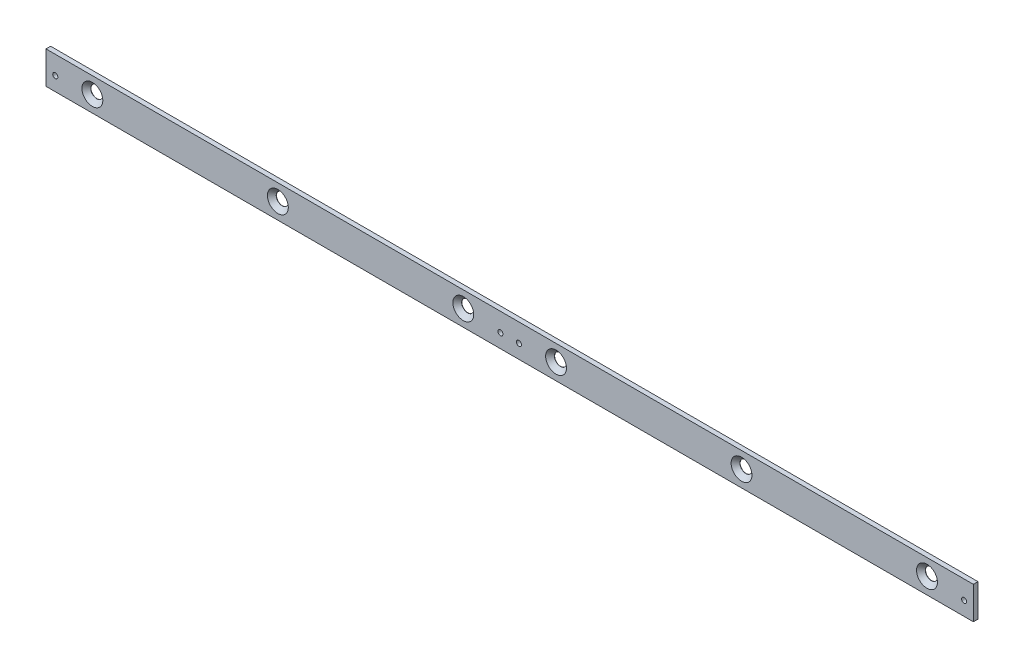
ISO-10303-21;
HEADER;
FILE_DESCRIPTION(('STEP AP214'),'2;1');
FILE_NAME('part.step','',(''),(''),'','','');
FILE_SCHEMA(('AUTOMOTIVE_DESIGN { 1 0 10303 214 1 1 1 1 }'));
ENDSEC;
DATA;
#1=APPLICATION_CONTEXT('core data for automotive mechanical design processes');
#2=APPLICATION_PROTOCOL_DEFINITION('international standard','automotive_design',2000,#1);
#3=PRODUCT_CONTEXT('',#1,'mechanical');
#4=PRODUCT('Part','Part','',(#3));
#5=PRODUCT_RELATED_PRODUCT_CATEGORY('part','',(#4));
#6=PRODUCT_DEFINITION_FORMATION('','',#4);
#7=PRODUCT_DEFINITION_CONTEXT('part definition',#1,'design');
#8=PRODUCT_DEFINITION('design','',#6,#7);
#9=PRODUCT_DEFINITION_SHAPE('','',#8);
#10=(LENGTH_UNIT() NAMED_UNIT(*) SI_UNIT(.MILLI.,.METRE.));
#11=(NAMED_UNIT(*) PLANE_ANGLE_UNIT() SI_UNIT($,.RADIAN.));
#12=(NAMED_UNIT(*) SI_UNIT($,.STERADIAN.) SOLID_ANGLE_UNIT());
#13=UNCERTAINTY_MEASURE_WITH_UNIT(LENGTH_MEASURE(1.E-05),#10,'distance_accuracy_value','');
#14=(GEOMETRIC_REPRESENTATION_CONTEXT(3) GLOBAL_UNCERTAINTY_ASSIGNED_CONTEXT((#13)) GLOBAL_UNIT_ASSIGNED_CONTEXT((#10,
#11,#12)) REPRESENTATION_CONTEXT('',''));
#15=CARTESIAN_POINT('',(0.,0.,0.));
#16=DIRECTION('',(0.,0.,1.));
#17=DIRECTION('',(1.,0.,0.));
#18=AXIS2_PLACEMENT_3D('',#15,#16,#17);
#19=CARTESIAN_POINT('',(-200.,6.99999999999999,2.));
#20=DIRECTION('',(0.,0.,-1.));
#21=DIRECTION('',(-1.,0.,0.));
#22=AXIS2_PLACEMENT_3D('',#19,#20,#21);
#23=PLANE('',#22);
#24=CARTESIAN_POINT('',(180.,0.,2.));
#25=DIRECTION('',(0.,0.,-1.));
#26=DIRECTION('',(-1.,0.,0.));
#27=AXIS2_PLACEMENT_3D('',#24,#25,#26);
#28=CIRCLE('',#27,4.5);
#29=CARTESIAN_POINT('',(175.5,0.,2.));
#30=VERTEX_POINT('',#29);
#31=EDGE_CURVE('E130',#30,#30,#28,.T.);
#32=ORIENTED_EDGE('',*,*,#31,.T.);
#33=EDGE_LOOP('',(#32));
#34=FACE_BOUND('',#33,.T.);
#35=CARTESIAN_POINT('',(100.,0.,2.));
#36=DIRECTION('',(0.,0.,-1.));
#37=DIRECTION('',(-1.,0.,0.));
#38=AXIS2_PLACEMENT_3D('',#35,#36,#37);
#39=CIRCLE('',#38,4.5);
#40=CARTESIAN_POINT('',(95.5,0.,2.));
#41=VERTEX_POINT('',#40);
#42=EDGE_CURVE('E127',#41,#41,#39,.T.);
#43=ORIENTED_EDGE('',*,*,#42,.T.);
#44=EDGE_LOOP('',(#43));
#45=FACE_BOUND('',#44,.T.);
#46=CARTESIAN_POINT('',(20.,0.,2.));
#47=DIRECTION('',(0.,0.,-1.));
#48=DIRECTION('',(-1.,0.,0.));
#49=AXIS2_PLACEMENT_3D('',#46,#47,#48);
#50=CIRCLE('',#49,4.5);
#51=CARTESIAN_POINT('',(15.5,0.,2.));
#52=VERTEX_POINT('',#51);
#53=EDGE_CURVE('E124',#52,#52,#50,.T.);
#54=ORIENTED_EDGE('',*,*,#53,.T.);
#55=EDGE_LOOP('',(#54));
#56=FACE_BOUND('',#55,.T.);
#57=CARTESIAN_POINT('',(-20.,0.,2.));
#58=DIRECTION('',(0.,0.,-1.));
#59=DIRECTION('',(-1.,0.,0.));
#60=AXIS2_PLACEMENT_3D('',#57,#58,#59);
#61=CIRCLE('',#60,4.5);
#62=CARTESIAN_POINT('',(-24.5,0.,2.));
#63=VERTEX_POINT('',#62);
#64=EDGE_CURVE('E121',#63,#63,#61,.T.);
#65=ORIENTED_EDGE('',*,*,#64,.T.);
#66=EDGE_LOOP('',(#65));
#67=FACE_BOUND('',#66,.T.);
#68=CARTESIAN_POINT('',(-100.,0.,2.));
#69=DIRECTION('',(0.,0.,-1.));
#70=DIRECTION('',(-1.,0.,0.));
#71=AXIS2_PLACEMENT_3D('',#68,#69,#70);
#72=CIRCLE('',#71,4.5);
#73=CARTESIAN_POINT('',(-104.5,0.,2.));
#74=VERTEX_POINT('',#73);
#75=EDGE_CURVE('E118',#74,#74,#72,.T.);
#76=ORIENTED_EDGE('',*,*,#75,.T.);
#77=EDGE_LOOP('',(#76));
#78=FACE_BOUND('',#77,.T.);
#79=CARTESIAN_POINT('',(-180.,0.,2.));
#80=DIRECTION('',(0.,0.,-1.));
#81=DIRECTION('',(-1.,0.,0.));
#82=AXIS2_PLACEMENT_3D('',#79,#80,#81);
#83=CIRCLE('',#82,4.5);
#84=CARTESIAN_POINT('',(-184.5,0.,2.));
#85=VERTEX_POINT('',#84);
#86=EDGE_CURVE('E115',#85,#85,#83,.T.);
#87=ORIENTED_EDGE('',*,*,#86,.T.);
#88=EDGE_LOOP('',(#87));
#89=FACE_BOUND('',#88,.T.);
#90=CARTESIAN_POINT('',(4.00000000000001,-1.,2.));
#91=DIRECTION('',(0.,0.,1.));
#92=DIRECTION('',(-1.,0.,0.));
#93=AXIS2_PLACEMENT_3D('',#90,#91,#92);
#94=CIRCLE('',#93,1.1);
#95=CARTESIAN_POINT('',(2.90000000000001,-1.,2.));
#96=VERTEX_POINT('',#95);
#97=EDGE_CURVE('E398',#96,#96,#94,.T.);
#98=ORIENTED_EDGE('',*,*,#97,.F.);
#99=EDGE_LOOP('',(#98));
#100=FACE_BOUND('',#99,.T.);
#101=CARTESIAN_POINT('',(-196.,-1.,2.));
#102=DIRECTION('',(0.,0.,1.));
#103=DIRECTION('',(1.,0.,0.));
#104=AXIS2_PLACEMENT_3D('',#101,#102,#103);
#105=CIRCLE('',#104,1.09999999999999);
#106=CARTESIAN_POINT('',(-194.9,-1.,2.));
#107=VERTEX_POINT('',#106);
#108=EDGE_CURVE('E408',#107,#107,#105,.T.);
#109=ORIENTED_EDGE('',*,*,#108,.F.);
#110=EDGE_LOOP('',(#109));
#111=FACE_BOUND('',#110,.T.);
#112=DIRECTION('',(0.,-1.,0.));
#113=VECTOR('',#112,1.);
#114=CARTESIAN_POINT('',(-200.,-7.00000000000001,2.));
#115=LINE('',#114,#113);
#116=CARTESIAN_POINT('',(-200.,6.99999999999999,2.));
#117=VERTEX_POINT('',#116);
#118=CARTESIAN_POINT('',(-200.,-7.00000000000001,2.));
#119=VERTEX_POINT('',#118);
#120=EDGE_CURVE('E103',#117,#119,#115,.T.);
#121=ORIENTED_EDGE('',*,*,#120,.T.);
#122=DIRECTION('',(1.,0.,0.));
#123=VECTOR('',#122,1.);
#124=CARTESIAN_POINT('',(-200.,-7.00000000000001,2.));
#125=LINE('',#124,#123);
#126=CARTESIAN_POINT('',(200.,-6.99999999999996,2.));
#127=VERTEX_POINT('',#126);
#128=EDGE_CURVE('E85',#119,#127,#125,.T.);
#129=ORIENTED_EDGE('',*,*,#128,.T.);
#130=DIRECTION('',(0.,1.,0.));
#131=VECTOR('',#130,1.);
#132=CARTESIAN_POINT('',(200.,-6.99999999999996,2.));
#133=LINE('',#132,#131);
#134=CARTESIAN_POINT('',(200.,7.00000000000004,2.));
#135=VERTEX_POINT('',#134);
#136=EDGE_CURVE('E49',#127,#135,#133,.T.);
#137=ORIENTED_EDGE('',*,*,#136,.T.);
#138=DIRECTION('',(-1.,0.,0.));
#139=VECTOR('',#138,1.);
#140=CARTESIAN_POINT('',(-200.,6.99999999999999,2.));
#141=LINE('',#140,#139);
#142=EDGE_CURVE('E44',#135,#117,#141,.T.);
#143=ORIENTED_EDGE('',*,*,#142,.T.);
#144=EDGE_LOOP('',(#121,#129,#137,#143));
#145=FACE_BOUND('',#144,.T.);
#146=CARTESIAN_POINT('',(-3.99999999999999,-1.,2.));
#147=DIRECTION('',(0.,0.,1.));
#148=DIRECTION('',(1.,0.,0.));
#149=AXIS2_PLACEMENT_3D('',#146,#147,#148);
#150=CIRCLE('',#149,1.1);
#151=CARTESIAN_POINT('',(-2.89999999999999,-1.,2.));
#152=VERTEX_POINT('',#151);
#153=EDGE_CURVE('E402',#152,#152,#150,.T.);
#154=ORIENTED_EDGE('',*,*,#153,.F.);
#155=EDGE_LOOP('',(#154));
#156=FACE_BOUND('',#155,.T.);
#157=CARTESIAN_POINT('',(196.,-0.999999999999953,2.));
#158=DIRECTION('',(0.,0.,1.));
#159=DIRECTION('',(-1.,0.,0.));
#160=AXIS2_PLACEMENT_3D('',#157,#158,#159);
#161=CIRCLE('',#160,1.09999999999999);
#162=CARTESIAN_POINT('',(194.9,-0.999999999999953,2.));
#163=VERTEX_POINT('',#162);
#164=EDGE_CURVE('E390',#163,#163,#161,.T.);
#165=ORIENTED_EDGE('',*,*,#164,.F.);
#166=EDGE_LOOP('',(#165));
#167=FACE_BOUND('',#166,.T.);
#168=ADVANCED_FACE('F29',(#34,#45,#56,#67,#78,#89,#100,#111,#145,#156,#167),#23,.F.);
#169=CARTESIAN_POINT('',(-200.,6.99999999999999,0.));
#170=DIRECTION('',(0.,0.,-1.));
#171=DIRECTION('',(-1.,0.,0.));
#172=AXIS2_PLACEMENT_3D('',#169,#170,#171);
#173=PLANE('',#172);
#174=CARTESIAN_POINT('',(4.00000000000001,-1.,0.));
#175=DIRECTION('',(0.,0.,1.));
#176=DIRECTION('',(-1.,0.,0.));
#177=AXIS2_PLACEMENT_3D('',#174,#175,#176);
#178=CIRCLE('',#177,1.1);
#179=CARTESIAN_POINT('',(2.90000000000001,-1.,0.));
#180=VERTEX_POINT('',#179);
#181=EDGE_CURVE('E393',#180,#180,#178,.T.);
#182=ORIENTED_EDGE('',*,*,#181,.T.);
#183=EDGE_LOOP('',(#182));
#184=FACE_BOUND('',#183,.T.);
#185=CARTESIAN_POINT('',(-196.,-1.,0.));
#186=DIRECTION('',(0.,0.,1.));
#187=DIRECTION('',(1.,0.,0.));
#188=AXIS2_PLACEMENT_3D('',#185,#186,#187);
#189=CIRCLE('',#188,1.09999999999999);
#190=CARTESIAN_POINT('',(-194.9,-1.,0.));
#191=VERTEX_POINT('',#190);
#192=EDGE_CURVE('E405',#191,#191,#189,.T.);
#193=ORIENTED_EDGE('',*,*,#192,.T.);
#194=EDGE_LOOP('',(#193));
#195=FACE_BOUND('',#194,.T.);
#196=CARTESIAN_POINT('',(100.,0.,0.));
#197=DIRECTION('',(0.,0.,1.));
#198=DIRECTION('',(-1.,0.,0.));
#199=AXIS2_PLACEMENT_3D('',#196,#197,#198);
#200=CIRCLE('',#199,2.6);
#201=CARTESIAN_POINT('',(97.4,0.,0.));
#202=VERTEX_POINT('',#201);
#203=EDGE_CURVE('E368',#202,#202,#200,.T.);
#204=ORIENTED_EDGE('',*,*,#203,.T.);
#205=EDGE_LOOP('',(#204));
#206=FACE_BOUND('',#205,.T.);
#207=CARTESIAN_POINT('',(-20.,0.,0.));
#208=DIRECTION('',(0.,0.,1.));
#209=DIRECTION('',(1.,0.,0.));
#210=AXIS2_PLACEMENT_3D('',#207,#208,#209);
#211=CIRCLE('',#210,2.6);
#212=CARTESIAN_POINT('',(-17.4,0.,0.));
#213=VERTEX_POINT('',#212);
#214=EDGE_CURVE('E367',#213,#213,#211,.T.);
#215=ORIENTED_EDGE('',*,*,#214,.T.);
#216=EDGE_LOOP('',(#215));
#217=FACE_BOUND('',#216,.T.);
#218=CARTESIAN_POINT('',(-180.,0.,0.));
#219=DIRECTION('',(0.,0.,1.));
#220=DIRECTION('',(1.,0.,0.));
#221=AXIS2_PLACEMENT_3D('',#218,#219,#220);
#222=CIRCLE('',#221,2.59999999999999);
#223=CARTESIAN_POINT('',(-177.4,0.,0.));
#224=VERTEX_POINT('',#223);
#225=EDGE_CURVE('E93',#224,#224,#222,.T.);
#226=ORIENTED_EDGE('',*,*,#225,.T.);
#227=EDGE_LOOP('',(#226));
#228=FACE_BOUND('',#227,.T.);
#229=DIRECTION('',(0.,-1.,0.));
#230=VECTOR('',#229,1.);
#231=CARTESIAN_POINT('',(-200.,-7.00000000000001,0.));
#232=LINE('',#231,#230);
#233=CARTESIAN_POINT('',(-200.,6.99999999999999,0.));
#234=VERTEX_POINT('',#233);
#235=CARTESIAN_POINT('',(-200.,-7.00000000000001,0.));
#236=VERTEX_POINT('',#235);
#237=EDGE_CURVE('E76',#234,#236,#232,.T.);
#238=ORIENTED_EDGE('',*,*,#237,.F.);
#239=DIRECTION('',(-1.,0.,0.));
#240=VECTOR('',#239,1.);
#241=CARTESIAN_POINT('',(-200.,6.99999999999999,0.));
#242=LINE('',#241,#240);
#243=CARTESIAN_POINT('',(200.,7.00000000000004,0.));
#244=VERTEX_POINT('',#243);
#245=EDGE_CURVE('E101',#244,#234,#242,.T.);
#246=ORIENTED_EDGE('',*,*,#245,.F.);
#247=DIRECTION('',(0.,1.,0.));
#248=VECTOR('',#247,1.);
#249=CARTESIAN_POINT('',(200.,-6.99999999999996,0.));
#250=LINE('',#249,#248);
#251=CARTESIAN_POINT('',(200.,-6.99999999999996,0.));
#252=VERTEX_POINT('',#251);
#253=EDGE_CURVE('E77',#252,#244,#250,.T.);
#254=ORIENTED_EDGE('',*,*,#253,.F.);
#255=DIRECTION('',(1.,0.,0.));
#256=VECTOR('',#255,1.);
#257=CARTESIAN_POINT('',(-200.,-7.00000000000001,0.));
#258=LINE('',#257,#256);
#259=EDGE_CURVE('E70',#236,#252,#258,.T.);
#260=ORIENTED_EDGE('',*,*,#259,.F.);
#261=EDGE_LOOP('',(#238,#246,#254,#260));
#262=FACE_BOUND('',#261,.T.);
#263=CARTESIAN_POINT('',(-100.,0.,0.));
#264=DIRECTION('',(0.,0.,1.));
#265=DIRECTION('',(1.,0.,0.));
#266=AXIS2_PLACEMENT_3D('',#263,#264,#265);
#267=CIRCLE('',#266,2.6);
#268=CARTESIAN_POINT('',(-97.4,0.,0.));
#269=VERTEX_POINT('',#268);
#270=EDGE_CURVE('E96',#269,#269,#267,.T.);
#271=ORIENTED_EDGE('',*,*,#270,.T.);
#272=EDGE_LOOP('',(#271));
#273=FACE_BOUND('',#272,.T.);
#274=CARTESIAN_POINT('',(20.,0.,0.));
#275=DIRECTION('',(0.,0.,1.));
#276=DIRECTION('',(-1.,0.,0.));
#277=AXIS2_PLACEMENT_3D('',#274,#275,#276);
#278=CIRCLE('',#277,2.6);
#279=CARTESIAN_POINT('',(17.4,0.,0.));
#280=VERTEX_POINT('',#279);
#281=EDGE_CURVE('E365',#280,#280,#278,.T.);
#282=ORIENTED_EDGE('',*,*,#281,.T.);
#283=EDGE_LOOP('',(#282));
#284=FACE_BOUND('',#283,.T.);
#285=CARTESIAN_POINT('',(180.,0.,0.));
#286=DIRECTION('',(0.,0.,1.));
#287=DIRECTION('',(-1.,0.,0.));
#288=AXIS2_PLACEMENT_3D('',#285,#286,#287);
#289=CIRCLE('',#288,2.59999999999999);
#290=CARTESIAN_POINT('',(177.4,0.,0.));
#291=VERTEX_POINT('',#290);
#292=EDGE_CURVE('E373',#291,#291,#289,.T.);
#293=ORIENTED_EDGE('',*,*,#292,.T.);
#294=EDGE_LOOP('',(#293));
#295=FACE_BOUND('',#294,.T.);
#296=CARTESIAN_POINT('',(-3.99999999999999,-1.,0.));
#297=DIRECTION('',(0.,0.,1.));
#298=DIRECTION('',(1.,0.,0.));
#299=AXIS2_PLACEMENT_3D('',#296,#297,#298);
#300=CIRCLE('',#299,1.1);
#301=CARTESIAN_POINT('',(-2.89999999999999,-1.,0.));
#302=VERTEX_POINT('',#301);
#303=EDGE_CURVE('E385',#302,#302,#300,.T.);
#304=ORIENTED_EDGE('',*,*,#303,.T.);
#305=EDGE_LOOP('',(#304));
#306=FACE_BOUND('',#305,.T.);
#307=CARTESIAN_POINT('',(196.,-0.999999999999953,0.));
#308=DIRECTION('',(0.,0.,1.));
#309=DIRECTION('',(-1.,0.,0.));
#310=AXIS2_PLACEMENT_3D('',#307,#308,#309);
#311=CIRCLE('',#310,1.09999999999999);
#312=CARTESIAN_POINT('',(194.9,-0.999999999999953,0.));
#313=VERTEX_POINT('',#312);
#314=EDGE_CURVE('E388',#313,#313,#311,.T.);
#315=ORIENTED_EDGE('',*,*,#314,.T.);
#316=EDGE_LOOP('',(#315));
#317=FACE_BOUND('',#316,.T.);
#318=ADVANCED_FACE('F72',(#184,#195,#206,#217,#228,#262,#273,#284,#295,#306,#317),#173,.T.);
#319=CARTESIAN_POINT('',(-200.,-7.00000000000001,2.));
#320=DIRECTION('',(1.,0.,0.));
#321=DIRECTION('',(0.,0.,-1.));
#322=AXIS2_PLACEMENT_3D('',#319,#320,#321);
#323=PLANE('',#322);
#324=ORIENTED_EDGE('',*,*,#237,.T.);
#325=DIRECTION('',(0.,0.,-1.));
#326=VECTOR('',#325,1.);
#327=CARTESIAN_POINT('',(-200.,-7.00000000000001,2.));
#328=LINE('',#327,#326);
#329=EDGE_CURVE('E83',#119,#236,#328,.T.);
#330=ORIENTED_EDGE('',*,*,#329,.F.);
#331=ORIENTED_EDGE('',*,*,#120,.F.);
#332=DIRECTION('',(0.,0.,-1.));
#333=VECTOR('',#332,1.);
#334=CARTESIAN_POINT('',(-200.,6.99999999999999,2.));
#335=LINE('',#334,#333);
#336=EDGE_CURVE('E92',#117,#234,#335,.T.);
#337=ORIENTED_EDGE('',*,*,#336,.T.);
#338=EDGE_LOOP('',(#324,#330,#331,#337));
#339=FACE_BOUND('',#338,.T.);
#340=ADVANCED_FACE('F31',(#339),#323,.F.);
#341=CARTESIAN_POINT('',(-200.,-7.00000000000001,2.));
#342=DIRECTION('',(0.,1.,0.));
#343=DIRECTION('',(-1.,0.,0.));
#344=AXIS2_PLACEMENT_3D('',#341,#342,#343);
#345=PLANE('',#344);
#346=ORIENTED_EDGE('',*,*,#259,.T.);
#347=DIRECTION('',(0.,0.,-1.));
#348=VECTOR('',#347,1.);
#349=CARTESIAN_POINT('',(200.,-6.99999999999996,2.));
#350=LINE('',#349,#348);
#351=EDGE_CURVE('E89',#127,#252,#350,.T.);
#352=ORIENTED_EDGE('',*,*,#351,.F.);
#353=ORIENTED_EDGE('',*,*,#128,.F.);
#354=ORIENTED_EDGE('',*,*,#329,.T.);
#355=EDGE_LOOP('',(#346,#352,#353,#354));
#356=FACE_BOUND('',#355,.T.);
#357=ADVANCED_FACE('F84',(#356),#345,.F.);
#358=CARTESIAN_POINT('',(200.,-6.99999999999996,2.));
#359=DIRECTION('',(-1.,0.,0.));
#360=DIRECTION('',(0.,0.,1.));
#361=AXIS2_PLACEMENT_3D('',#358,#359,#360);
#362=PLANE('',#361);
#363=ORIENTED_EDGE('',*,*,#253,.T.);
#364=DIRECTION('',(0.,0.,-1.));
#365=VECTOR('',#364,1.);
#366=CARTESIAN_POINT('',(200.,7.00000000000004,2.));
#367=LINE('',#366,#365);
#368=EDGE_CURVE('E109',#135,#244,#367,.T.);
#369=ORIENTED_EDGE('',*,*,#368,.F.);
#370=ORIENTED_EDGE('',*,*,#136,.F.);
#371=ORIENTED_EDGE('',*,*,#351,.T.);
#372=EDGE_LOOP('',(#363,#369,#370,#371));
#373=FACE_BOUND('',#372,.T.);
#374=ADVANCED_FACE('F178',(#373),#362,.F.);
#375=CARTESIAN_POINT('',(-200.,6.99999999999999,2.));
#376=DIRECTION('',(0.,-1.,0.));
#377=DIRECTION('',(1.,0.,0.));
#378=AXIS2_PLACEMENT_3D('',#375,#376,#377);
#379=PLANE('',#378);
#380=ORIENTED_EDGE('',*,*,#245,.T.);
#381=ORIENTED_EDGE('',*,*,#336,.F.);
#382=ORIENTED_EDGE('',*,*,#142,.F.);
#383=ORIENTED_EDGE('',*,*,#368,.T.);
#384=EDGE_LOOP('',(#380,#381,#382,#383));
#385=FACE_BOUND('',#384,.T.);
#386=ADVANCED_FACE('F174',(#385),#379,.F.);
#387=CARTESIAN_POINT('',(-180.,0.,2.));
#388=DIRECTION('',(0.,0.,-1.));
#389=DIRECTION('',(-1.,0.,0.));
#390=AXIS2_PLACEMENT_3D('',#387,#388,#389);
#391=CYLINDRICAL_SURFACE('',#390,2.59999999999999);
#392=CARTESIAN_POINT('',(-180.,0.,0.0999999999999847));
#393=DIRECTION('',(0.,0.,-1.));
#394=DIRECTION('',(-1.,0.,0.));
#395=AXIS2_PLACEMENT_3D('',#392,#393,#394);
#396=CIRCLE('',#395,2.59999999999999);
#397=CARTESIAN_POINT('',(-182.6,0.,0.0999999999999847));
#398=VERTEX_POINT('',#397);
#399=EDGE_CURVE('E11',#398,#398,#396,.F.);
#400=ORIENTED_EDGE('',*,*,#399,.T.);
#401=EDGE_LOOP('',(#400));
#402=FACE_BOUND('',#401,.T.);
#403=ORIENTED_EDGE('',*,*,#225,.F.);
#404=EDGE_LOOP('',(#403));
#405=FACE_BOUND('',#404,.T.);
#406=ADVANCED_FACE('F177',(#402,#405),#391,.F.);
#407=CARTESIAN_POINT('',(-100.,0.,2.));
#408=DIRECTION('',(0.,0.,-1.));
#409=DIRECTION('',(-1.,0.,0.));
#410=AXIS2_PLACEMENT_3D('',#407,#408,#409);
#411=CYLINDRICAL_SURFACE('',#410,2.6);
#412=CARTESIAN_POINT('',(-100.,0.,0.099999999999999));
#413=DIRECTION('',(0.,0.,-1.));
#414=DIRECTION('',(-1.,0.,0.));
#415=AXIS2_PLACEMENT_3D('',#412,#413,#414);
#416=CIRCLE('',#415,2.6);
#417=CARTESIAN_POINT('',(-102.6,0.,0.099999999999999));
#418=VERTEX_POINT('',#417);
#419=EDGE_CURVE('E37',#418,#418,#416,.F.);
#420=ORIENTED_EDGE('',*,*,#419,.T.);
#421=EDGE_LOOP('',(#420));
#422=FACE_BOUND('',#421,.T.);
#423=ORIENTED_EDGE('',*,*,#270,.F.);
#424=EDGE_LOOP('',(#423));
#425=FACE_BOUND('',#424,.T.);
#426=ADVANCED_FACE('F144',(#422,#425),#411,.F.);
#427=CARTESIAN_POINT('',(-20.,0.,2.));
#428=DIRECTION('',(0.,0.,-1.));
#429=DIRECTION('',(-1.,0.,0.));
#430=AXIS2_PLACEMENT_3D('',#427,#428,#429);
#431=CYLINDRICAL_SURFACE('',#430,2.6);
#432=CARTESIAN_POINT('',(-20.,0.,0.100000000000002));
#433=DIRECTION('',(0.,0.,-1.));
#434=DIRECTION('',(-1.,0.,0.));
#435=AXIS2_PLACEMENT_3D('',#432,#433,#434);
#436=CIRCLE('',#435,2.6);
#437=CARTESIAN_POINT('',(-22.6,0.,0.100000000000002));
#438=VERTEX_POINT('',#437);
#439=EDGE_CURVE('E139',#438,#438,#436,.F.);
#440=ORIENTED_EDGE('',*,*,#439,.T.);
#441=EDGE_LOOP('',(#440));
#442=FACE_BOUND('',#441,.T.);
#443=ORIENTED_EDGE('',*,*,#214,.F.);
#444=EDGE_LOOP('',(#443));
#445=FACE_BOUND('',#444,.T.);
#446=ADVANCED_FACE('F230',(#442,#445),#431,.F.);
#447=CARTESIAN_POINT('',(20.,0.,2.));
#448=DIRECTION('',(0.,0.,-1.));
#449=DIRECTION('',(-1.,0.,0.));
#450=AXIS2_PLACEMENT_3D('',#447,#448,#449);
#451=CYLINDRICAL_SURFACE('',#450,2.6);
#452=CARTESIAN_POINT('',(20.,0.,0.100000000000002));
#453=DIRECTION('',(0.,0.,-1.));
#454=DIRECTION('',(-1.,0.,0.));
#455=AXIS2_PLACEMENT_3D('',#452,#453,#454);
#456=CIRCLE('',#455,2.6);
#457=CARTESIAN_POINT('',(17.4,0.,0.100000000000002));
#458=VERTEX_POINT('',#457);
#459=EDGE_CURVE('E136',#458,#458,#456,.F.);
#460=ORIENTED_EDGE('',*,*,#459,.T.);
#461=EDGE_LOOP('',(#460));
#462=FACE_BOUND('',#461,.T.);
#463=ORIENTED_EDGE('',*,*,#281,.F.);
#464=EDGE_LOOP('',(#463));
#465=FACE_BOUND('',#464,.T.);
#466=ADVANCED_FACE('F238',(#462,#465),#451,.F.);
#467=CARTESIAN_POINT('',(100.,0.,2.));
#468=DIRECTION('',(0.,0.,-1.));
#469=DIRECTION('',(-1.,0.,0.));
#470=AXIS2_PLACEMENT_3D('',#467,#468,#469);
#471=CYLINDRICAL_SURFACE('',#470,2.6);
#472=CARTESIAN_POINT('',(100.,0.,0.099999999999999));
#473=DIRECTION('',(0.,0.,-1.));
#474=DIRECTION('',(-1.,0.,0.));
#475=AXIS2_PLACEMENT_3D('',#472,#473,#474);
#476=CIRCLE('',#475,2.6);
#477=CARTESIAN_POINT('',(97.4,0.,0.099999999999999));
#478=VERTEX_POINT('',#477);
#479=EDGE_CURVE('E133',#478,#478,#476,.F.);
#480=ORIENTED_EDGE('',*,*,#479,.T.);
#481=EDGE_LOOP('',(#480));
#482=FACE_BOUND('',#481,.T.);
#483=ORIENTED_EDGE('',*,*,#203,.F.);
#484=EDGE_LOOP('',(#483));
#485=FACE_BOUND('',#484,.T.);
#486=ADVANCED_FACE('F247',(#482,#485),#471,.F.);
#487=CARTESIAN_POINT('',(180.,0.,2.));
#488=DIRECTION('',(0.,0.,-1.));
#489=DIRECTION('',(-1.,0.,0.));
#490=AXIS2_PLACEMENT_3D('',#487,#488,#489);
#491=CYLINDRICAL_SURFACE('',#490,2.59999999999999);
#492=CARTESIAN_POINT('',(180.,0.,0.0999999999999847));
#493=DIRECTION('',(0.,0.,-1.));
#494=DIRECTION('',(-1.,0.,0.));
#495=AXIS2_PLACEMENT_3D('',#492,#493,#494);
#496=CIRCLE('',#495,2.59999999999999);
#497=CARTESIAN_POINT('',(177.4,0.,0.0999999999999847));
#498=VERTEX_POINT('',#497);
#499=EDGE_CURVE('E88',#498,#498,#496,.F.);
#500=ORIENTED_EDGE('',*,*,#499,.T.);
#501=EDGE_LOOP('',(#500));
#502=FACE_BOUND('',#501,.T.);
#503=ORIENTED_EDGE('',*,*,#292,.F.);
#504=EDGE_LOOP('',(#503));
#505=FACE_BOUND('',#504,.T.);
#506=ADVANCED_FACE('F256',(#502,#505),#491,.F.);
#507=CARTESIAN_POINT('',(-196.,-1.,2.));
#508=DIRECTION('',(0.,0.,-1.));
#509=DIRECTION('',(-1.,0.,0.));
#510=AXIS2_PLACEMENT_3D('',#507,#508,#509);
#511=CYLINDRICAL_SURFACE('',#510,1.09999999999999);
#512=ORIENTED_EDGE('',*,*,#108,.T.);
#513=EDGE_LOOP('',(#512));
#514=FACE_BOUND('',#513,.T.);
#515=ORIENTED_EDGE('',*,*,#192,.F.);
#516=EDGE_LOOP('',(#515));
#517=FACE_BOUND('',#516,.T.);
#518=ADVANCED_FACE('F265',(#514,#517),#511,.F.);
#519=CARTESIAN_POINT('',(-3.99999999999999,-1.,2.));
#520=DIRECTION('',(0.,0.,-1.));
#521=DIRECTION('',(-1.,0.,0.));
#522=AXIS2_PLACEMENT_3D('',#519,#520,#521);
#523=CYLINDRICAL_SURFACE('',#522,1.1);
#524=ORIENTED_EDGE('',*,*,#153,.T.);
#525=EDGE_LOOP('',(#524));
#526=FACE_BOUND('',#525,.T.);
#527=ORIENTED_EDGE('',*,*,#303,.F.);
#528=EDGE_LOOP('',(#527));
#529=FACE_BOUND('',#528,.T.);
#530=ADVANCED_FACE('F274',(#526,#529),#523,.F.);
#531=CARTESIAN_POINT('',(4.00000000000001,-1.,2.));
#532=DIRECTION('',(0.,0.,-1.));
#533=DIRECTION('',(-1.,0.,0.));
#534=AXIS2_PLACEMENT_3D('',#531,#532,#533);
#535=CYLINDRICAL_SURFACE('',#534,1.1);
#536=ORIENTED_EDGE('',*,*,#97,.T.);
#537=EDGE_LOOP('',(#536));
#538=FACE_BOUND('',#537,.T.);
#539=ORIENTED_EDGE('',*,*,#181,.F.);
#540=EDGE_LOOP('',(#539));
#541=FACE_BOUND('',#540,.T.);
#542=ADVANCED_FACE('F283',(#538,#541),#535,.F.);
#543=CARTESIAN_POINT('',(196.,-0.999999999999953,2.));
#544=DIRECTION('',(0.,0.,-1.));
#545=DIRECTION('',(-1.,0.,0.));
#546=AXIS2_PLACEMENT_3D('',#543,#544,#545);
#547=CYLINDRICAL_SURFACE('',#546,1.09999999999999);
#548=ORIENTED_EDGE('',*,*,#164,.T.);
#549=EDGE_LOOP('',(#548));
#550=FACE_BOUND('',#549,.T.);
#551=ORIENTED_EDGE('',*,*,#314,.F.);
#552=EDGE_LOOP('',(#551));
#553=FACE_BOUND('',#552,.T.);
#554=ADVANCED_FACE('F292',(#550,#553),#547,.F.);
#555=CARTESIAN_POINT('',(180.,0.,0.0999999999999847));
#556=DIRECTION('',(0.,0.,1.));
#557=DIRECTION('',(1.,0.,0.));
#558=AXIS2_PLACEMENT_3D('',#555,#556,#557);
#559=CONICAL_SURFACE('',#558,2.59999999999999,0.785398163397448);
#560=ORIENTED_EDGE('',*,*,#31,.F.);
#561=EDGE_LOOP('',(#560));
#562=FACE_BOUND('',#561,.T.);
#563=ORIENTED_EDGE('',*,*,#499,.F.);
#564=EDGE_LOOP('',(#563));
#565=FACE_BOUND('',#564,.T.);
#566=ADVANCED_FACE('F301',(#562,#565),#559,.F.);
#567=CARTESIAN_POINT('',(100.,0.,0.099999999999999));
#568=DIRECTION('',(0.,0.,1.));
#569=DIRECTION('',(1.,0.,0.));
#570=AXIS2_PLACEMENT_3D('',#567,#568,#569);
#571=CONICAL_SURFACE('',#570,2.6,0.785398163397448);
#572=ORIENTED_EDGE('',*,*,#42,.F.);
#573=EDGE_LOOP('',(#572));
#574=FACE_BOUND('',#573,.T.);
#575=ORIENTED_EDGE('',*,*,#479,.F.);
#576=EDGE_LOOP('',(#575));
#577=FACE_BOUND('',#576,.T.);
#578=ADVANCED_FACE('F309',(#574,#577),#571,.F.);
#579=CARTESIAN_POINT('',(20.,0.,0.100000000000002));
#580=DIRECTION('',(0.,0.,1.));
#581=DIRECTION('',(1.,0.,0.));
#582=AXIS2_PLACEMENT_3D('',#579,#580,#581);
#583=CONICAL_SURFACE('',#582,2.6,0.78539816339745);
#584=ORIENTED_EDGE('',*,*,#53,.F.);
#585=EDGE_LOOP('',(#584));
#586=FACE_BOUND('',#585,.T.);
#587=ORIENTED_EDGE('',*,*,#459,.F.);
#588=EDGE_LOOP('',(#587));
#589=FACE_BOUND('',#588,.T.);
#590=ADVANCED_FACE('F159',(#586,#589),#583,.F.);
#591=CARTESIAN_POINT('',(-20.,0.,0.100000000000002));
#592=DIRECTION('',(0.,0.,1.));
#593=DIRECTION('',(1.,0.,0.));
#594=AXIS2_PLACEMENT_3D('',#591,#592,#593);
#595=CONICAL_SURFACE('',#594,2.6,0.78539816339745);
#596=ORIENTED_EDGE('',*,*,#64,.F.);
#597=EDGE_LOOP('',(#596));
#598=FACE_BOUND('',#597,.T.);
#599=ORIENTED_EDGE('',*,*,#439,.F.);
#600=EDGE_LOOP('',(#599));
#601=FACE_BOUND('',#600,.T.);
#602=ADVANCED_FACE('F150',(#598,#601),#595,.F.);
#603=CARTESIAN_POINT('',(-100.,0.,0.099999999999999));
#604=DIRECTION('',(0.,0.,1.));
#605=DIRECTION('',(1.,0.,0.));
#606=AXIS2_PLACEMENT_3D('',#603,#604,#605);
#607=CONICAL_SURFACE('',#606,2.6,0.785398163397448);
#608=ORIENTED_EDGE('',*,*,#75,.F.);
#609=EDGE_LOOP('',(#608));
#610=FACE_BOUND('',#609,.T.);
#611=ORIENTED_EDGE('',*,*,#419,.F.);
#612=EDGE_LOOP('',(#611));
#613=FACE_BOUND('',#612,.T.);
#614=ADVANCED_FACE('F147',(#610,#613),#607,.F.);
#615=CARTESIAN_POINT('',(-180.,0.,0.0999999999999847));
#616=DIRECTION('',(0.,0.,1.));
#617=DIRECTION('',(1.,0.,0.));
#618=AXIS2_PLACEMENT_3D('',#615,#616,#617);
#619=CONICAL_SURFACE('',#618,2.59999999999999,0.785398163397448);
#620=ORIENTED_EDGE('',*,*,#86,.F.);
#621=EDGE_LOOP('',(#620));
#622=FACE_BOUND('',#621,.T.);
#623=ORIENTED_EDGE('',*,*,#399,.F.);
#624=EDGE_LOOP('',(#623));
#625=FACE_BOUND('',#624,.T.);
#626=ADVANCED_FACE('F149',(#622,#625),#619,.F.);
#627=CLOSED_SHELL('',(#168,#318,#340,#357,#374,#386,#406,#426,#446,#466,#486,#506,#518,#530,
#542,#554,#566,#578,#590,#602,#614,#626));
#628=MANIFOLD_SOLID_BREP('B2',#627);
#629=ADVANCED_BREP_SHAPE_REPRESENTATION('',(#18,#628),#14);
#630=SHAPE_DEFINITION_REPRESENTATION(#9,#629);
ENDSEC;
END-ISO-10303-21;
